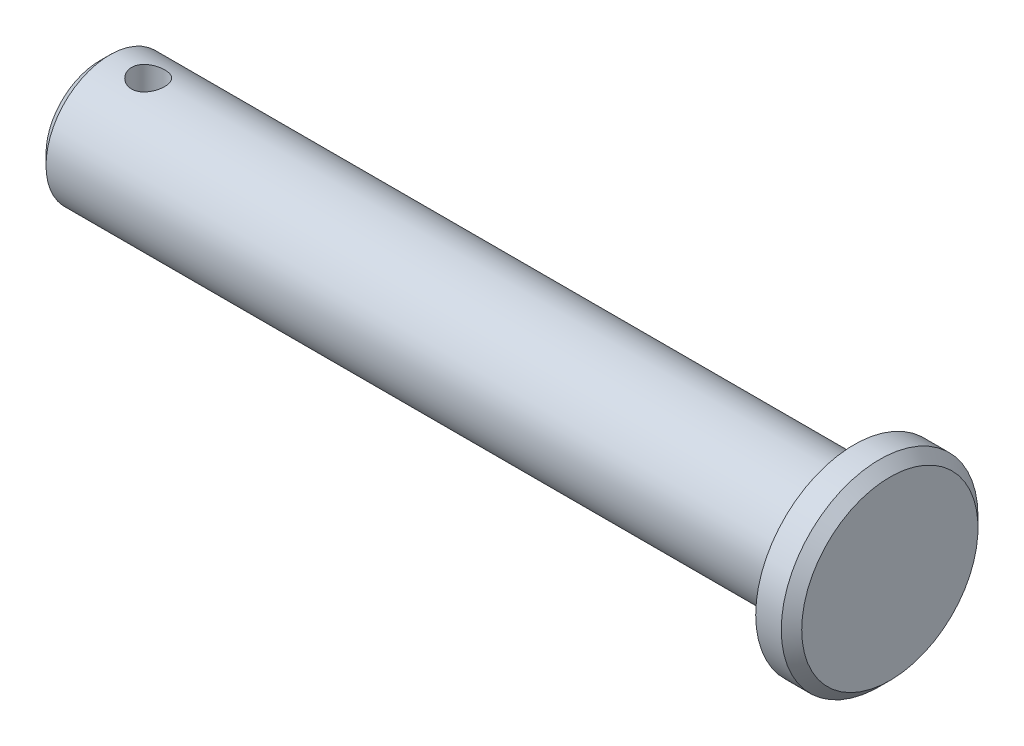
ISO-10303-21;
HEADER;
FILE_DESCRIPTION(('STEP AP214'),'2;1');
FILE_NAME('part.step','',(''),(''),'','','');
FILE_SCHEMA(('AUTOMOTIVE_DESIGN { 1 0 10303 214 1 1 1 1 }'));
ENDSEC;
DATA;
#1=APPLICATION_CONTEXT('core data for automotive mechanical design processes');
#2=APPLICATION_PROTOCOL_DEFINITION('international standard','automotive_design',2000,#1);
#3=PRODUCT_CONTEXT('',#1,'mechanical');
#4=PRODUCT('Part','Part','',(#3));
#5=PRODUCT_RELATED_PRODUCT_CATEGORY('part','',(#4));
#6=PRODUCT_DEFINITION_FORMATION('','',#4);
#7=PRODUCT_DEFINITION_CONTEXT('part definition',#1,'design');
#8=PRODUCT_DEFINITION('design','',#6,#7);
#9=PRODUCT_DEFINITION_SHAPE('','',#8);
#10=(LENGTH_UNIT() NAMED_UNIT(*) SI_UNIT(.MILLI.,.METRE.));
#11=(NAMED_UNIT(*) PLANE_ANGLE_UNIT() SI_UNIT($,.RADIAN.));
#12=(NAMED_UNIT(*) SI_UNIT($,.STERADIAN.) SOLID_ANGLE_UNIT());
#13=UNCERTAINTY_MEASURE_WITH_UNIT(LENGTH_MEASURE(1.E-05),#10,'distance_accuracy_value','');
#14=(GEOMETRIC_REPRESENTATION_CONTEXT(3) GLOBAL_UNCERTAINTY_ASSIGNED_CONTEXT((#13)) GLOBAL_UNIT_ASSIGNED_CONTEXT((#10,
#11,#12)) REPRESENTATION_CONTEXT('',''));
#15=CARTESIAN_POINT('',(0.,0.,0.));
#16=DIRECTION('',(0.,0.,1.));
#17=DIRECTION('',(1.,0.,0.));
#18=AXIS2_PLACEMENT_3D('',#15,#16,#17);
#19=CARTESIAN_POINT('',(77.315,0.,0.));
#20=DIRECTION('',(-1.,0.,0.));
#21=DIRECTION('',(0.,0.,1.));
#22=AXIS2_PLACEMENT_3D('',#19,#20,#21);
#23=PLANE('',#22);
#24=CARTESIAN_POINT('',(77.315,0.,0.));
#25=DIRECTION('',(-1.,0.,0.));
#26=DIRECTION('',(0.,0.,1.));
#27=AXIS2_PLACEMENT_3D('',#24,#25,#26);
#28=CIRCLE('',#27,17.25);
#29=CARTESIAN_POINT('',(77.315,0.,17.25));
#30=VERTEX_POINT('',#29);
#31=EDGE_CURVE('E10',#30,#30,#28,.T.);
#32=ORIENTED_EDGE('',*,*,#31,.F.);
#33=EDGE_LOOP('',(#32));
#34=FACE_BOUND('',#33,.T.);
#35=ADVANCED_FACE('F37',(#34),#23,.F.);
#36=CARTESIAN_POINT('',(77.315,0.,0.));
#37=DIRECTION('',(-1.,0.,0.));
#38=DIRECTION('',(0.,0.,1.));
#39=AXIS2_PLACEMENT_3D('',#36,#37,#38);
#40=CONICAL_SURFACE('',#39,17.25,0.785398163397447);
#41=CARTESIAN_POINT('',(75.315,0.,0.));
#42=DIRECTION('',(-1.,0.,0.));
#43=DIRECTION('',(0.,0.,1.));
#44=AXIS2_PLACEMENT_3D('',#41,#42,#43);
#45=CIRCLE('',#44,19.25);
#46=CARTESIAN_POINT('',(75.315,0.,19.25));
#47=VERTEX_POINT('',#46);
#48=EDGE_CURVE('E49',#47,#47,#45,.T.);
#49=ORIENTED_EDGE('',*,*,#48,.F.);
#50=EDGE_LOOP('',(#49));
#51=FACE_BOUND('',#50,.T.);
#52=ORIENTED_EDGE('',*,*,#31,.T.);
#53=EDGE_LOOP('',(#52));
#54=FACE_BOUND('',#53,.T.);
#55=ADVANCED_FACE('F87',(#51,#54),#40,.T.);
#56=CARTESIAN_POINT('',(-77.315,0.,0.));
#57=DIRECTION('',(-1.,0.,0.));
#58=DIRECTION('',(0.,0.,1.));
#59=AXIS2_PLACEMENT_3D('',#56,#57,#58);
#60=CYLINDRICAL_SURFACE('',#59,19.25);
#61=CARTESIAN_POINT('',(70.315,0.,0.));
#62=DIRECTION('',(-1.,0.,0.));
#63=DIRECTION('',(0.,0.,1.));
#64=AXIS2_PLACEMENT_3D('',#61,#62,#63);
#65=CIRCLE('',#64,19.25);
#66=CARTESIAN_POINT('',(70.315,0.,19.25));
#67=VERTEX_POINT('',#66);
#68=EDGE_CURVE('E54',#67,#67,#65,.T.);
#69=ORIENTED_EDGE('',*,*,#68,.F.);
#70=EDGE_LOOP('',(#69));
#71=FACE_BOUND('',#70,.T.);
#72=ORIENTED_EDGE('',*,*,#48,.T.);
#73=EDGE_LOOP('',(#72));
#74=FACE_BOUND('',#73,.T.);
#75=ADVANCED_FACE('F92',(#71,#74),#60,.T.);
#76=CARTESIAN_POINT('',(70.315,19.25,0.));
#77=DIRECTION('',(1.,0.,0.));
#78=DIRECTION('',(0.,0.,-1.));
#79=AXIS2_PLACEMENT_3D('',#76,#77,#78);
#80=PLANE('',#79);
#81=CARTESIAN_POINT('',(70.315,0.,0.));
#82=DIRECTION('',(-1.,0.,0.));
#83=DIRECTION('',(0.,0.,1.));
#84=AXIS2_PLACEMENT_3D('',#81,#82,#83);
#85=CIRCLE('',#84,12.5);
#86=CARTESIAN_POINT('',(70.315,0.,12.5));
#87=VERTEX_POINT('',#86);
#88=EDGE_CURVE('E106',#87,#87,#85,.T.);
#89=ORIENTED_EDGE('',*,*,#88,.F.);
#90=EDGE_LOOP('',(#89));
#91=FACE_BOUND('',#90,.T.);
#92=ORIENTED_EDGE('',*,*,#68,.T.);
#93=EDGE_LOOP('',(#92));
#94=FACE_BOUND('',#93,.T.);
#95=ADVANCED_FACE('F82',(#91,#94),#80,.F.);
#96=CARTESIAN_POINT('',(-77.315,0.,0.));
#97=DIRECTION('',(-1.,0.,0.));
#98=DIRECTION('',(0.,0.,1.));
#99=AXIS2_PLACEMENT_3D('',#96,#97,#98);
#100=CYLINDRICAL_SURFACE('',#99,12.5);
#101=CARTESIAN_POINT('',(-67.815,-12.0701077045733,3.25000000000001));
#102=CARTESIAN_POINT('',(-67.6357885954813,-12.0701109573982,3.24999535178113));
#103=CARTESIAN_POINT('',(-67.4565271110855,-12.0741425908511,3.23512639697315));
#104=CARTESIAN_POINT('',(-67.1031693023618,-12.0897881676305,3.17614884790338));
#105=CARTESIAN_POINT('',(-66.9290757890962,-12.1014061612356,3.13202463437075));
#106=CARTESIAN_POINT('',(-66.5912164630232,-12.1308216935703,3.01607533822269));
#107=CARTESIAN_POINT('',(-66.4274369652351,-12.1486108310136,2.94428790118148));
#108=CARTESIAN_POINT('',(-66.1142235998337,-12.188353656464,2.77516657772717));
#109=CARTESIAN_POINT('',(-65.9647906438448,-12.210307608853,2.6778310693744));
#110=CARTESIAN_POINT('',(-65.6809577814269,-12.2564913332899,2.45790196762269));
#111=CARTESIAN_POINT('',(-65.5469495733315,-12.280759850753,2.33481089596256));
#112=CARTESIAN_POINT('',(-65.3012280196932,-12.3285031518504,2.06793534575671));
#113=CARTESIAN_POINT('',(-65.1895168911414,-12.3519778563635,1.92414881191203));
#114=CARTESIAN_POINT('',(-64.9899397364803,-12.3959194289913,1.61726111047983));
#115=CARTESIAN_POINT('',(-64.9024612447029,-12.4163352528835,1.45389997653955));
#116=CARTESIAN_POINT('',(-64.7563568196019,-12.4514152229145,1.11417056289528));
#117=CARTESIAN_POINT('',(-64.6977262699012,-12.4660802892388,0.937804369516635));
#118=CARTESIAN_POINT('',(-64.6122444185742,-12.4877324473615,0.581157741498522));
#119=CARTESIAN_POINT('',(-64.5847272679288,-12.4948801723699,0.401046821083343));
#120=CARTESIAN_POINT('',(-64.5601604063271,-12.5012531662289,0.0386327508821778));
#121=CARTESIAN_POINT('',(-64.5631058382884,-12.5004796980681,-0.143670044792212));
#122=CARTESIAN_POINT('',(-64.5989075642838,-12.4912159156495,-0.50066512385632));
#123=CARTESIAN_POINT('',(-64.6310447432983,-12.4829111371108,-0.6754350698673));
#124=CARTESIAN_POINT('',(-64.7231583408352,-12.4597356136684,-1.0170108145033));
#125=CARTESIAN_POINT('',(-64.7831363058879,-12.4448645040133,-1.18381617013483));
#126=CARTESIAN_POINT('',(-64.9297924979954,-12.4099485405509,-1.50658740876954));
#127=CARTESIAN_POINT('',(-65.0167209788508,-12.3898554928598,-1.66243415738996));
#128=CARTESIAN_POINT('',(-65.2146194759968,-12.3466665928588,-1.9575762183214));
#129=CARTESIAN_POINT('',(-65.3255939759614,-12.3235701808565,-2.09686843632711));
#130=CARTESIAN_POINT('',(-65.5722671863206,-12.2760868825507,-2.35923845302994));
#131=CARTESIAN_POINT('',(-65.7085936173599,-12.2516820085968,-2.48172349723348));
#132=CARTESIAN_POINT('',(-66.0001060251361,-12.2049448337488,-2.702232859288));
#133=CARTESIAN_POINT('',(-66.1552930370178,-12.1826126467309,-2.80025583365963));
#134=CARTESIAN_POINT('',(-66.4813566235132,-12.1424802811445,-2.96948026869847));
#135=CARTESIAN_POINT('',(-66.6523163418386,-12.1247062331819,-3.04052815701658));
#136=CARTESIAN_POINT('',(-67.0043297967005,-12.0960312749224,-3.15268381624372));
#137=CARTESIAN_POINT('',(-67.1853811605704,-12.0851287564037,-3.19379859308707));
#138=CARTESIAN_POINT('',(-67.5469138101008,-12.0717718519797,-3.24391476190108));
#139=CARTESIAN_POINT('',(-67.7272645433665,-12.0690857581667,-3.25379719756266));
#140=CARTESIAN_POINT('',(-68.0870402014958,-12.0718332019216,-3.24358933567582));
#141=CARTESIAN_POINT('',(-68.2664652175856,-12.0772659234555,-3.22350205042832));
#142=CARTESIAN_POINT('',(-68.6159519843272,-12.0954157697153,-3.15469998588877));
#143=CARTESIAN_POINT('',(-68.7861242389842,-12.1079997596083,-3.10650801182699));
#144=CARTESIAN_POINT('',(-69.1159723579425,-12.1389056713158,-2.98344905344029));
#145=CARTESIAN_POINT('',(-69.2756468993667,-12.1572283146206,-2.90857871482456));
#146=CARTESIAN_POINT('',(-69.5836722501889,-12.1980276011193,-2.73247717350931));
#147=CARTESIAN_POINT('',(-69.731714352027,-12.2205834904775,-2.63072477625172));
#148=CARTESIAN_POINT('',(-70.0089462489922,-12.2671181282773,-2.40439879989121));
#149=CARTESIAN_POINT('',(-70.1381326744878,-12.2910971299641,-2.2798211507173));
#150=CARTESIAN_POINT('',(-70.3776073691842,-12.3385688083207,-2.00731864410626));
#151=CARTESIAN_POINT('',(-70.4872832262937,-12.3620303224023,-1.85884911980559));
#152=CARTESIAN_POINT('',(-70.6801513294656,-12.4051491994823,-1.54509249859947));
#153=CARTESIAN_POINT('',(-70.7633449788849,-12.4248067640396,-1.37980629346377));
#154=CARTESIAN_POINT('',(-70.9001385963343,-12.4579769251599,-1.03826690311396));
#155=CARTESIAN_POINT('',(-70.9539567863995,-12.471534699114,-0.862105718034382));
#156=CARTESIAN_POINT('',(-71.0311145152478,-12.4911761164616,-0.502837049160073));
#157=CARTESIAN_POINT('',(-71.0544604508987,-12.4972613285118,-0.319731031562753));
#158=CARTESIAN_POINT('',(-71.0696267651941,-12.5012019892906,0.0424954133206551));
#159=CARTESIAN_POINT('',(-71.0623476432301,-12.4992925217517,0.221576127725293));
#160=CARTESIAN_POINT('',(-71.0185498152792,-12.4879858018465,0.575871036634163));
#161=CARTESIAN_POINT('',(-70.9820321118936,-12.4785888062302,0.751085363506479));
#162=CARTESIAN_POINT('',(-70.8812925313222,-12.4534054132527,1.09164766573276));
#163=CARTESIAN_POINT('',(-70.8172453146038,-12.4376593358794,1.257050484072));
#164=CARTESIAN_POINT('',(-70.6634215044186,-12.4014288567053,1.57485660758888));
#165=CARTESIAN_POINT('',(-70.5736414449483,-12.3809438166767,1.7272581580113));
#166=CARTESIAN_POINT('',(-70.3682198655676,-12.3367798925157,2.01895989700419));
#167=CARTESIAN_POINT('',(-70.2519755695591,-12.3130327153406,2.157825244317));
#168=CARTESIAN_POINT('',(-69.9980795014073,-12.2653095573742,2.41438331885253));
#169=CARTESIAN_POINT('',(-69.8604221916498,-12.2413335189069,2.53207055217988));
#170=CARTESIAN_POINT('',(-69.5641930313259,-12.1953008053636,2.74532550015592));
#171=CARTESIAN_POINT('',(-69.4052485671912,-12.1732938799442,2.84038727425697));
#172=CARTESIAN_POINT('',(-69.0730819265395,-12.1343795273366,3.0023016148278));
#173=CARTESIAN_POINT('',(-68.8998696190876,-12.1174686123345,3.06917348760505));
#174=CARTESIAN_POINT('',(-68.575129694205,-12.0931300782527,3.16356306125911));
#175=CARTESIAN_POINT('',(-68.4250714178756,-12.0845645189861,3.19590306708418));
#176=CARTESIAN_POINT('',(-68.1216874302689,-12.0730522257394,3.23912243522354));
#177=CARTESIAN_POINT('',(-67.968362052536,-12.070104920934,3.25000397776242));
#178=CARTESIAN_POINT('',(-67.815,-12.0701077045733,3.25000000000001));
#179=B_SPLINE_CURVE_WITH_KNOTS('',3,(#101,#102,#103,#104,#105,#106,#107,#108,#109,#110,#111,
#112,#113,#114,#115,#116,#117,#118,#119,#120,#121,#122,#123,#124,#125,#126,#127,#128,#129,#130,
#131,#132,#133,#134,#135,#136,#137,#138,#139,#140,#141,#142,#143,#144,#145,#146,#147,#148,#149,
#150,#151,#152,#153,#154,#155,#156,#157,#158,#159,#160,#161,#162,#163,#164,#165,#166,#167,#168,
#169,#170,#171,#172,#173,#174,#175,#176,#177,#178),.UNSPECIFIED.,.T.,.F.,(4,2,2,2,2,2,2,2,2,2,2,
2,2,2,2,2,2,2,2,2,2,2,2,2,2,2,2,2,2,2,2,2,2,2,2,2,2,2,4),(0.,0.537070585366152,1.07442814181089,
1.61105700156233,2.14771993786828,2.69590642873234,3.2441473984725,3.80070711961765,
4.35717774859144,4.90149970278471,5.44573486933554,5.97691640068851,6.50812744222307,
7.04442685876538,7.58082636107377,8.13290034432251,8.6850046413125,9.240206612548,
9.79527859528774,10.3345457987712,10.8737588033625,11.4032475650856,11.9328029233325,
12.4734934119641,13.0142804074905,13.5698352862046,14.125360719806,14.67670111084,
15.2279257434832,15.7630571972261,16.2981703019111,16.8299373742636,17.3617761049811,
17.9072189278757,18.4528030428377,19.0096330020194,19.5660809852347,20.025731515924,
20.4853353427546),.UNSPECIFIED.);
#180=CARTESIAN_POINT('',(-67.815,-12.0701077045733,3.25000000000001));
#181=VERTEX_POINT('',#180);
#182=EDGE_CURVE('E40',#181,#181,#179,.T.);
#183=ORIENTED_EDGE('',*,*,#182,.T.);
#184=EDGE_LOOP('',(#183));
#185=FACE_BOUND('',#184,.T.);
#186=CARTESIAN_POINT('',(-67.815,12.0701077045733,3.25000000000001));
#187=CARTESIAN_POINT('',(-67.9942114045187,12.0701109573982,3.24999535178113));
#188=CARTESIAN_POINT('',(-68.1734728889145,12.0741425908511,3.23512639697315));
#189=CARTESIAN_POINT('',(-68.5268306976382,12.0897881676305,3.17614884790338));
#190=CARTESIAN_POINT('',(-68.7009242109038,12.1014061612356,3.13202463437075));
#191=CARTESIAN_POINT('',(-69.0387835369768,12.1308216935703,3.01607533822269));
#192=CARTESIAN_POINT('',(-69.2025630347648,12.1486108310136,2.94428790118148));
#193=CARTESIAN_POINT('',(-69.5157764001663,12.188353656464,2.77516657772717));
#194=CARTESIAN_POINT('',(-69.6652093561552,12.210307608853,2.6778310693744));
#195=CARTESIAN_POINT('',(-69.9490422185731,12.2564913332899,2.45790196762269));
#196=CARTESIAN_POINT('',(-70.0830504266685,12.280759850753,2.33481089596256));
#197=CARTESIAN_POINT('',(-70.3287719803068,12.3285031518504,2.06793534575671));
#198=CARTESIAN_POINT('',(-70.4404831088585,12.3519778563635,1.92414881191203));
#199=CARTESIAN_POINT('',(-70.6400602635197,12.3959194289913,1.61726111047983));
#200=CARTESIAN_POINT('',(-70.7275387552971,12.4163352528835,1.45389997653955));
#201=CARTESIAN_POINT('',(-70.8736431803981,12.4514152229145,1.11417056289528));
#202=CARTESIAN_POINT('',(-70.9322737300988,12.4660802892388,0.937804369516636));
#203=CARTESIAN_POINT('',(-71.0177555814258,12.4877324473615,0.581157741498522));
#204=CARTESIAN_POINT('',(-71.0452727320712,12.4948801723699,0.401046821083343));
#205=CARTESIAN_POINT('',(-71.0698395936729,12.5012531662289,0.0386327508821778));
#206=CARTESIAN_POINT('',(-71.0668941617115,12.5004796980681,-0.143670044792212));
#207=CARTESIAN_POINT('',(-71.0310924357162,12.4912159156495,-0.500665123856318));
#208=CARTESIAN_POINT('',(-70.9989552567017,12.4829111371108,-0.675435069867297));
#209=CARTESIAN_POINT('',(-70.9068416591648,12.4597356136684,-1.0170108145033));
#210=CARTESIAN_POINT('',(-70.8468636941121,12.4448645040133,-1.18381617013483));
#211=CARTESIAN_POINT('',(-70.7002075020046,12.4099485405509,-1.50658740876954));
#212=CARTESIAN_POINT('',(-70.6132790211492,12.3898554928598,-1.66243415738996));
#213=CARTESIAN_POINT('',(-70.4153805240032,12.3466665928588,-1.9575762183214));
#214=CARTESIAN_POINT('',(-70.3044060240385,12.3235701808565,-2.09686843632711));
#215=CARTESIAN_POINT('',(-70.0577328136793,12.2760868825507,-2.35923845302994));
#216=CARTESIAN_POINT('',(-69.92140638264,12.2516820085968,-2.48172349723348));
#217=CARTESIAN_POINT('',(-69.6298939748638,12.2049448337488,-2.702232859288));
#218=CARTESIAN_POINT('',(-69.4747069629822,12.1826126467309,-2.80025583365963));
#219=CARTESIAN_POINT('',(-69.1486433764868,12.1424802811445,-2.96948026869847));
#220=CARTESIAN_POINT('',(-68.9776836581614,12.1247062331819,-3.04052815701658));
#221=CARTESIAN_POINT('',(-68.6256702032994,12.0960312749224,-3.15268381624372));
#222=CARTESIAN_POINT('',(-68.4446188394296,12.0851287564037,-3.19379859308707));
#223=CARTESIAN_POINT('',(-68.0830861898992,12.0717718519797,-3.24391476190107));
#224=CARTESIAN_POINT('',(-67.9027354566335,12.0690857581667,-3.25379719756266));
#225=CARTESIAN_POINT('',(-67.5429597985042,12.0718332019216,-3.24358933567582));
#226=CARTESIAN_POINT('',(-67.3635347824144,12.0772659234555,-3.22350205042832));
#227=CARTESIAN_POINT('',(-67.0140480156728,12.0954157697153,-3.15469998588877));
#228=CARTESIAN_POINT('',(-66.8438757610158,12.1079997596083,-3.10650801182699));
#229=CARTESIAN_POINT('',(-66.5140276420575,12.1389056713158,-2.98344905344029));
#230=CARTESIAN_POINT('',(-66.3543531006332,12.1572283146206,-2.90857871482456));
#231=CARTESIAN_POINT('',(-66.0463277498111,12.1980276011193,-2.73247717350931));
#232=CARTESIAN_POINT('',(-65.8982856479729,12.2205834904775,-2.63072477625172));
#233=CARTESIAN_POINT('',(-65.6210537510078,12.2671181282773,-2.40439879989121));
#234=CARTESIAN_POINT('',(-65.4918673255122,12.2910971299641,-2.2798211507173));
#235=CARTESIAN_POINT('',(-65.2523926308157,12.3385688083207,-2.00731864410626));
#236=CARTESIAN_POINT('',(-65.1427167737063,12.3620303224023,-1.85884911980559));
#237=CARTESIAN_POINT('',(-64.9498486705344,12.4051491994823,-1.54509249859947));
#238=CARTESIAN_POINT('',(-64.8666550211151,12.4248067640396,-1.37980629346377));
#239=CARTESIAN_POINT('',(-64.7298614036657,12.4579769251599,-1.03826690311396));
#240=CARTESIAN_POINT('',(-64.6760432136005,12.471534699114,-0.862105718034382));
#241=CARTESIAN_POINT('',(-64.5988854847521,12.4911761164616,-0.502837049160073));
#242=CARTESIAN_POINT('',(-64.5755395491012,12.4972613285118,-0.319731031562753));
#243=CARTESIAN_POINT('',(-64.5603732348059,12.5012019892906,0.0424954133206551));
#244=CARTESIAN_POINT('',(-64.5676523567699,12.4992925217517,0.221576127725293));
#245=CARTESIAN_POINT('',(-64.6114501847207,12.4879858018465,0.575871036634163));
#246=CARTESIAN_POINT('',(-64.6479678881064,12.4785888062302,0.751085363506479));
#247=CARTESIAN_POINT('',(-64.7487074686778,12.4534054132527,1.09164766573276));
#248=CARTESIAN_POINT('',(-64.8127546853962,12.4376593358794,1.257050484072));
#249=CARTESIAN_POINT('',(-64.9665784955813,12.4014288567053,1.57485660758888));
#250=CARTESIAN_POINT('',(-65.0563585550517,12.3809438166767,1.7272581580113));
#251=CARTESIAN_POINT('',(-65.2617801344323,12.3367798925157,2.01895989700419));
#252=CARTESIAN_POINT('',(-65.3780244304409,12.3130327153406,2.15782524431701));
#253=CARTESIAN_POINT('',(-65.6319204985927,12.2653095573742,2.41438331885254));
#254=CARTESIAN_POINT('',(-65.7695778083502,12.2413335189069,2.53207055217988));
#255=CARTESIAN_POINT('',(-66.0658069686741,12.1953008053636,2.74532550015592));
#256=CARTESIAN_POINT('',(-66.2247514328088,12.1732938799442,2.84038727425697));
#257=CARTESIAN_POINT('',(-66.5569180734604,12.1343795273366,3.0023016148278));
#258=CARTESIAN_POINT('',(-66.7301303809124,12.1174686123345,3.06917348760505));
#259=CARTESIAN_POINT('',(-67.054870305795,12.0931300782527,3.16356306125911));
#260=CARTESIAN_POINT('',(-67.2049285821244,12.0845645189861,3.19590306708418));
#261=CARTESIAN_POINT('',(-67.5083125697311,12.0730522257394,3.23912243522354));
#262=CARTESIAN_POINT('',(-67.6616379474639,12.070104920934,3.25000397776242));
#263=CARTESIAN_POINT('',(-67.815,12.0701077045733,3.25000000000001));
#264=B_SPLINE_CURVE_WITH_KNOTS('',3,(#186,#187,#188,#189,#190,#191,#192,#193,#194,#195,#196,
#197,#198,#199,#200,#201,#202,#203,#204,#205,#206,#207,#208,#209,#210,#211,#212,#213,#214,#215,
#216,#217,#218,#219,#220,#221,#222,#223,#224,#225,#226,#227,#228,#229,#230,#231,#232,#233,#234,
#235,#236,#237,#238,#239,#240,#241,#242,#243,#244,#245,#246,#247,#248,#249,#250,#251,#252,#253,
#254,#255,#256,#257,#258,#259,#260,#261,#262,#263),.UNSPECIFIED.,.T.,.F.,(4,2,2,2,2,2,2,2,2,2,2,
2,2,2,2,2,2,2,2,2,2,2,2,2,2,2,2,2,2,2,2,2,2,2,2,2,2,2,4),(0.,0.537070585366152,1.07442814181089,
1.61105700156233,2.14771993786828,2.69590642873234,3.2441473984725,3.80070711961765,
4.35717774859145,4.90149970278471,5.44573486933554,5.9769164006885,6.50812744222307,
7.04442685876538,7.58082636107377,8.13290034432251,8.6850046413125,9.240206612548,
9.79527859528774,10.3345457987712,10.8737588033625,11.4032475650856,11.9328029233325,
12.4734934119641,13.0142804074905,13.5698352862046,14.125360719806,14.67670111084,
15.2279257434832,15.7630571972261,16.2981703019111,16.8299373742636,17.3617761049811,
17.9072189278757,18.4528030428377,19.0096330020194,19.5660809852347,20.025731515924,
20.4853353427546),.UNSPECIFIED.);
#265=CARTESIAN_POINT('',(-67.815,12.0701077045733,3.25000000000001));
#266=VERTEX_POINT('',#265);
#267=EDGE_CURVE('E57',#266,#266,#264,.T.);
#268=ORIENTED_EDGE('',*,*,#267,.T.);
#269=EDGE_LOOP('',(#268));
#270=FACE_BOUND('',#269,.T.);
#271=CARTESIAN_POINT('',(-75.315,0.,0.));
#272=DIRECTION('',(-1.,0.,0.));
#273=DIRECTION('',(0.,0.,1.));
#274=AXIS2_PLACEMENT_3D('',#271,#272,#273);
#275=CIRCLE('',#274,12.5);
#276=CARTESIAN_POINT('',(-75.315,0.,12.5));
#277=VERTEX_POINT('',#276);
#278=EDGE_CURVE('E109',#277,#277,#275,.T.);
#279=ORIENTED_EDGE('',*,*,#278,.F.);
#280=EDGE_LOOP('',(#279));
#281=FACE_BOUND('',#280,.T.);
#282=ORIENTED_EDGE('',*,*,#88,.T.);
#283=EDGE_LOOP('',(#282));
#284=FACE_BOUND('',#283,.T.);
#285=ADVANCED_FACE('F62',(#185,#270,#281,#284),#100,.T.);
#286=CARTESIAN_POINT('',(-75.315,0.,0.));
#287=DIRECTION('',(1.,0.,0.));
#288=DIRECTION('',(0.,0.,-1.));
#289=AXIS2_PLACEMENT_3D('',#286,#287,#288);
#290=CONICAL_SURFACE('',#289,12.5,0.785398163397452);
#291=CARTESIAN_POINT('',(-77.315,0.,0.));
#292=DIRECTION('',(-1.,0.,0.));
#293=DIRECTION('',(0.,0.,1.));
#294=AXIS2_PLACEMENT_3D('',#291,#292,#293);
#295=CIRCLE('',#294,10.5);
#296=CARTESIAN_POINT('',(-77.315,0.,10.5));
#297=VERTEX_POINT('',#296);
#298=EDGE_CURVE('E114',#297,#297,#295,.T.);
#299=ORIENTED_EDGE('',*,*,#298,.F.);
#300=EDGE_LOOP('',(#299));
#301=FACE_BOUND('',#300,.T.);
#302=ORIENTED_EDGE('',*,*,#278,.T.);
#303=EDGE_LOOP('',(#302));
#304=FACE_BOUND('',#303,.T.);
#305=ADVANCED_FACE('F74',(#301,#304),#290,.T.);
#306=CARTESIAN_POINT('',(-77.315,10.5,0.));
#307=DIRECTION('',(1.,0.,0.));
#308=DIRECTION('',(0.,0.,-1.));
#309=AXIS2_PLACEMENT_3D('',#306,#307,#308);
#310=PLANE('',#309);
#311=ORIENTED_EDGE('',*,*,#298,.T.);
#312=EDGE_LOOP('',(#311));
#313=FACE_BOUND('',#312,.T.);
#314=ADVANCED_FACE('F70',(#313),#310,.F.);
#315=CARTESIAN_POINT('',(-67.815,-19.25,0.));
#316=DIRECTION('',(0.,1.,0.));
#317=DIRECTION('',(0.,0.,1.));
#318=AXIS2_PLACEMENT_3D('',#315,#316,#317);
#319=CYLINDRICAL_SURFACE('',#318,3.25000000000001);
#320=ORIENTED_EDGE('',*,*,#267,.F.);
#321=EDGE_LOOP('',(#320));
#322=FACE_BOUND('',#321,.T.);
#323=ORIENTED_EDGE('',*,*,#182,.F.);
#324=EDGE_LOOP('',(#323));
#325=FACE_BOUND('',#324,.T.);
#326=ADVANCED_FACE('F66',(#322,#325),#319,.F.);
#327=CLOSED_SHELL('',(#35,#55,#75,#95,#285,#305,#314,#326));
#328=MANIFOLD_SOLID_BREP('B2',#327);
#329=ADVANCED_BREP_SHAPE_REPRESENTATION('',(#18,#328),#14);
#330=SHAPE_DEFINITION_REPRESENTATION(#9,#329);
ENDSEC;
END-ISO-10303-21;
